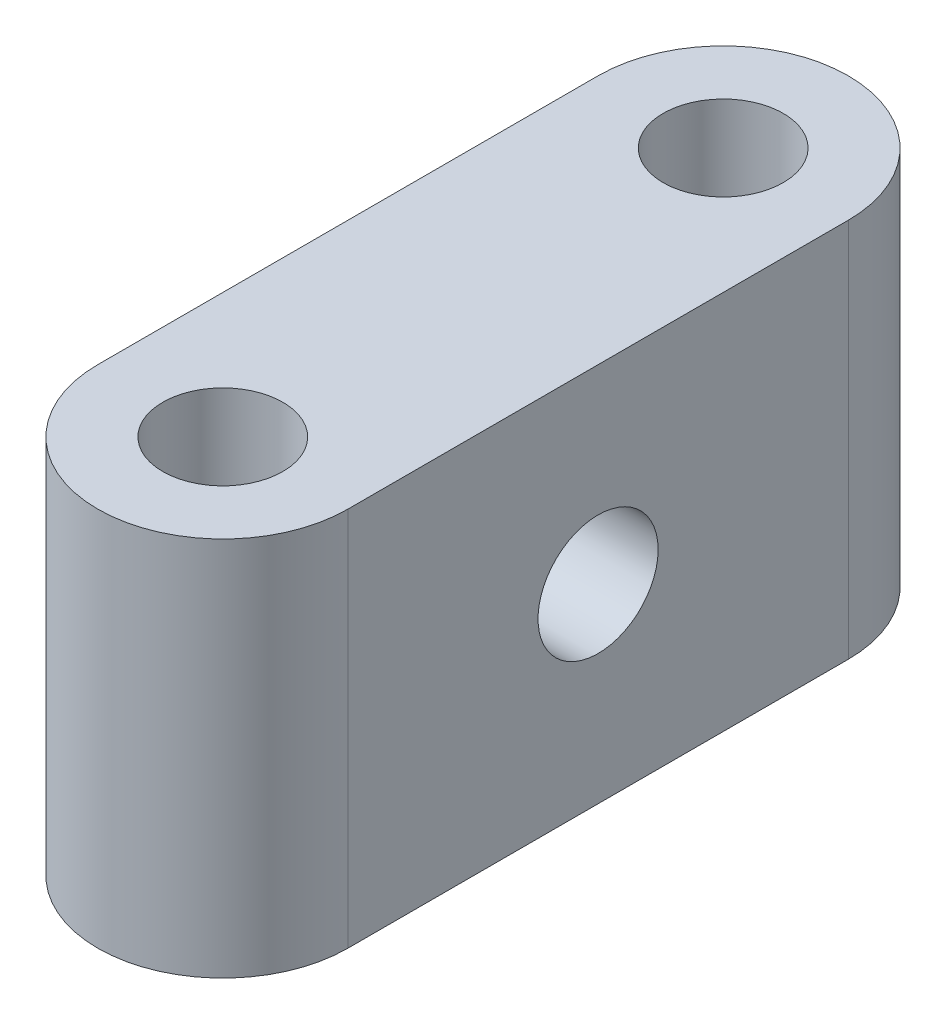
ISO-10303-21;
HEADER;
FILE_DESCRIPTION(('STEP AP214'),'2;1');
FILE_NAME('part.step','',(''),(''),'','','');
FILE_SCHEMA(('AUTOMOTIVE_DESIGN { 1 0 10303 214 1 1 1 1 }'));
ENDSEC;
DATA;
#1=APPLICATION_CONTEXT('core data for automotive mechanical design processes');
#2=APPLICATION_PROTOCOL_DEFINITION('international standard','automotive_design',2000,#1);
#3=PRODUCT_CONTEXT('',#1,'mechanical');
#4=PRODUCT('Part','Part','',(#3));
#5=PRODUCT_RELATED_PRODUCT_CATEGORY('part','',(#4));
#6=PRODUCT_DEFINITION_FORMATION('','',#4);
#7=PRODUCT_DEFINITION_CONTEXT('part definition',#1,'design');
#8=PRODUCT_DEFINITION('design','',#6,#7);
#9=PRODUCT_DEFINITION_SHAPE('','',#8);
#10=(LENGTH_UNIT() NAMED_UNIT(*) SI_UNIT(.MILLI.,.METRE.));
#11=(NAMED_UNIT(*) PLANE_ANGLE_UNIT() SI_UNIT($,.RADIAN.));
#12=(NAMED_UNIT(*) SI_UNIT($,.STERADIAN.) SOLID_ANGLE_UNIT());
#13=UNCERTAINTY_MEASURE_WITH_UNIT(LENGTH_MEASURE(1.E-05),#10,'distance_accuracy_value','');
#14=(GEOMETRIC_REPRESENTATION_CONTEXT(3) GLOBAL_UNCERTAINTY_ASSIGNED_CONTEXT((#13)) GLOBAL_UNIT_ASSIGNED_CONTEXT((#10,
#11,#12)) REPRESENTATION_CONTEXT('',''));
#15=CARTESIAN_POINT('',(0.,0.,0.));
#16=DIRECTION('',(0.,0.,1.));
#17=DIRECTION('',(1.,0.,0.));
#18=AXIS2_PLACEMENT_3D('',#15,#16,#17);
#19=CARTESIAN_POINT('',(0.,19.,0.));
#20=DIRECTION('',(0.,1.,0.));
#21=DIRECTION('',(0.,0.,1.));
#22=AXIS2_PLACEMENT_3D('',#19,#20,#21);
#23=PLANE('',#22);
#24=CARTESIAN_POINT('',(0.,19.,-50.));
#25=DIRECTION('',(0.,1.,0.));
#26=DIRECTION('',(0.,0.,1.));
#27=AXIS2_PLACEMENT_3D('',#24,#25,#26);
#28=CIRCLE('',#27,6.);
#29=CARTESIAN_POINT('',(0.,19.,-44.));
#30=VERTEX_POINT('',#29);
#31=EDGE_CURVE('E106',#30,#30,#28,.T.);
#32=ORIENTED_EDGE('',*,*,#31,.F.);
#33=EDGE_LOOP('',(#32));
#34=FACE_BOUND('',#33,.T.);
#35=CARTESIAN_POINT('',(0.,19.,0.));
#36=DIRECTION('',(0.,1.,0.));
#37=DIRECTION('',(0.,0.,1.));
#38=AXIS2_PLACEMENT_3D('',#35,#36,#37);
#39=CIRCLE('',#38,12.5);
#40=CARTESIAN_POINT('',(-12.5,19.,0.));
#41=VERTEX_POINT('',#40);
#42=CARTESIAN_POINT('',(12.5,19.,0.));
#43=VERTEX_POINT('',#42);
#44=EDGE_CURVE('E93',#41,#43,#39,.T.);
#45=ORIENTED_EDGE('',*,*,#44,.T.);
#46=DIRECTION('',(0.,0.,-1.));
#47=VECTOR('',#46,1.);
#48=CARTESIAN_POINT('',(12.5,19.,0.));
#49=LINE('',#48,#47);
#50=CARTESIAN_POINT('',(12.5,19.,-50.));
#51=VERTEX_POINT('',#50);
#52=EDGE_CURVE('E88',#43,#51,#49,.T.);
#53=ORIENTED_EDGE('',*,*,#52,.T.);
#54=CARTESIAN_POINT('',(0.,19.,-50.));
#55=DIRECTION('',(0.,1.,0.));
#56=DIRECTION('',(0.,0.,1.));
#57=AXIS2_PLACEMENT_3D('',#54,#55,#56);
#58=CIRCLE('',#57,12.5);
#59=CARTESIAN_POINT('',(-12.5,19.,-50.));
#60=VERTEX_POINT('',#59);
#61=EDGE_CURVE('E90',#51,#60,#58,.T.);
#62=ORIENTED_EDGE('',*,*,#61,.T.);
#63=DIRECTION('',(0.,0.,1.));
#64=VECTOR('',#63,1.);
#65=CARTESIAN_POINT('',(-12.5,19.,0.));
#66=LINE('',#65,#64);
#67=EDGE_CURVE('E57',#60,#41,#66,.T.);
#68=ORIENTED_EDGE('',*,*,#67,.T.);
#69=EDGE_LOOP('',(#45,#53,#62,#68));
#70=FACE_BOUND('',#69,.T.);
#71=CARTESIAN_POINT('',(0.,19.,0.));
#72=DIRECTION('',(0.,1.,0.));
#73=DIRECTION('',(0.,0.,1.));
#74=AXIS2_PLACEMENT_3D('',#71,#72,#73);
#75=CIRCLE('',#74,6.);
#76=CARTESIAN_POINT('',(0.,19.,6.));
#77=VERTEX_POINT('',#76);
#78=EDGE_CURVE('E122',#77,#77,#75,.T.);
#79=ORIENTED_EDGE('',*,*,#78,.F.);
#80=EDGE_LOOP('',(#79));
#81=FACE_BOUND('',#80,.T.);
#82=ADVANCED_FACE('F39',(#34,#70,#81),#23,.T.);
#83=CARTESIAN_POINT('',(0.,-19.,0.));
#84=DIRECTION('',(0.,1.,0.));
#85=DIRECTION('',(0.,0.,1.));
#86=AXIS2_PLACEMENT_3D('',#83,#84,#85);
#87=PLANE('',#86);
#88=CARTESIAN_POINT('',(0.,-19.,0.));
#89=DIRECTION('',(0.,1.,0.));
#90=DIRECTION('',(0.,0.,1.));
#91=AXIS2_PLACEMENT_3D('',#88,#89,#90);
#92=CIRCLE('',#91,12.5);
#93=CARTESIAN_POINT('',(-12.5,-19.,0.));
#94=VERTEX_POINT('',#93);
#95=CARTESIAN_POINT('',(12.5,-19.,0.));
#96=VERTEX_POINT('',#95);
#97=EDGE_CURVE('E103',#94,#96,#92,.T.);
#98=ORIENTED_EDGE('',*,*,#97,.F.);
#99=DIRECTION('',(0.,0.,1.));
#100=VECTOR('',#99,1.);
#101=CARTESIAN_POINT('',(-12.5,-19.,0.));
#102=LINE('',#101,#100);
#103=CARTESIAN_POINT('',(-12.5,-19.,-50.));
#104=VERTEX_POINT('',#103);
#105=EDGE_CURVE('E76',#104,#94,#102,.T.);
#106=ORIENTED_EDGE('',*,*,#105,.F.);
#107=CARTESIAN_POINT('',(0.,-19.,-50.));
#108=DIRECTION('',(0.,1.,0.));
#109=DIRECTION('',(0.,0.,1.));
#110=AXIS2_PLACEMENT_3D('',#107,#108,#109);
#111=CIRCLE('',#110,12.5);
#112=CARTESIAN_POINT('',(12.5,-19.,-50.));
#113=VERTEX_POINT('',#112);
#114=EDGE_CURVE('E71',#113,#104,#111,.T.);
#115=ORIENTED_EDGE('',*,*,#114,.F.);
#116=DIRECTION('',(0.,0.,-1.));
#117=VECTOR('',#116,1.);
#118=CARTESIAN_POINT('',(12.5,-19.,0.));
#119=LINE('',#118,#117);
#120=EDGE_CURVE('E92',#96,#113,#119,.T.);
#121=ORIENTED_EDGE('',*,*,#120,.F.);
#122=EDGE_LOOP('',(#98,#106,#115,#121));
#123=FACE_BOUND('',#122,.T.);
#124=CARTESIAN_POINT('',(0.,-19.,-50.));
#125=DIRECTION('',(0.,1.,0.));
#126=DIRECTION('',(0.,0.,1.));
#127=AXIS2_PLACEMENT_3D('',#124,#125,#126);
#128=CIRCLE('',#127,6.);
#129=CARTESIAN_POINT('',(0.,-19.,-44.));
#130=VERTEX_POINT('',#129);
#131=EDGE_CURVE('E119',#130,#130,#128,.T.);
#132=ORIENTED_EDGE('',*,*,#131,.T.);
#133=EDGE_LOOP('',(#132));
#134=FACE_BOUND('',#133,.T.);
#135=CARTESIAN_POINT('',(0.,-19.,0.));
#136=DIRECTION('',(0.,1.,0.));
#137=DIRECTION('',(0.,0.,1.));
#138=AXIS2_PLACEMENT_3D('',#135,#136,#137);
#139=CIRCLE('',#138,6.);
#140=CARTESIAN_POINT('',(0.,-19.,6.));
#141=VERTEX_POINT('',#140);
#142=EDGE_CURVE('E121',#141,#141,#139,.T.);
#143=ORIENTED_EDGE('',*,*,#142,.T.);
#144=EDGE_LOOP('',(#143));
#145=FACE_BOUND('',#144,.T.);
#146=ADVANCED_FACE('F111',(#123,#134,#145),#87,.F.);
#147=CARTESIAN_POINT('',(0.,19.,0.));
#148=DIRECTION('',(0.,-1.,0.));
#149=DIRECTION('',(0.,0.,-1.));
#150=AXIS2_PLACEMENT_3D('',#147,#148,#149);
#151=CYLINDRICAL_SURFACE('',#150,12.5);
#152=ORIENTED_EDGE('',*,*,#97,.T.);
#153=DIRECTION('',(0.,-1.,0.));
#154=VECTOR('',#153,1.);
#155=CARTESIAN_POINT('',(12.5,19.,0.));
#156=LINE('',#155,#154);
#157=EDGE_CURVE('E11',#43,#96,#156,.T.);
#158=ORIENTED_EDGE('',*,*,#157,.F.);
#159=ORIENTED_EDGE('',*,*,#44,.F.);
#160=DIRECTION('',(0.,-1.,0.));
#161=VECTOR('',#160,1.);
#162=CARTESIAN_POINT('',(-12.5,19.,0.));
#163=LINE('',#162,#161);
#164=EDGE_CURVE('E97',#41,#94,#163,.T.);
#165=ORIENTED_EDGE('',*,*,#164,.T.);
#166=EDGE_LOOP('',(#152,#158,#159,#165));
#167=FACE_BOUND('',#166,.T.);
#168=ADVANCED_FACE('F41',(#167),#151,.T.);
#169=CARTESIAN_POINT('',(12.5,19.,0.));
#170=DIRECTION('',(-1.,0.,0.));
#171=DIRECTION('',(0.,0.,1.));
#172=AXIS2_PLACEMENT_3D('',#169,#170,#171);
#173=PLANE('',#172);
#174=CARTESIAN_POINT('',(12.5,0.,-25.));
#175=DIRECTION('',(1.,0.,0.));
#176=DIRECTION('',(0.,0.,-1.));
#177=AXIS2_PLACEMENT_3D('',#174,#175,#176);
#178=CIRCLE('',#177,6.);
#179=CARTESIAN_POINT('',(12.5,0.,-31.));
#180=VERTEX_POINT('',#179);
#181=EDGE_CURVE('E128',#180,#180,#178,.T.);
#182=ORIENTED_EDGE('',*,*,#181,.F.);
#183=EDGE_LOOP('',(#182));
#184=FACE_BOUND('',#183,.T.);
#185=ORIENTED_EDGE('',*,*,#120,.T.);
#186=DIRECTION('',(0.,-1.,0.));
#187=VECTOR('',#186,1.);
#188=CARTESIAN_POINT('',(12.5,19.,-50.));
#189=LINE('',#188,#187);
#190=EDGE_CURVE('E48',#51,#113,#189,.T.);
#191=ORIENTED_EDGE('',*,*,#190,.F.);
#192=ORIENTED_EDGE('',*,*,#52,.F.);
#193=ORIENTED_EDGE('',*,*,#157,.T.);
#194=EDGE_LOOP('',(#185,#191,#192,#193));
#195=FACE_BOUND('',#194,.T.);
#196=ADVANCED_FACE('F94',(#184,#195),#173,.F.);
#197=CARTESIAN_POINT('',(0.,19.,-50.));
#198=DIRECTION('',(0.,-1.,0.));
#199=DIRECTION('',(0.,0.,-1.));
#200=AXIS2_PLACEMENT_3D('',#197,#198,#199);
#201=CYLINDRICAL_SURFACE('',#200,12.5);
#202=ORIENTED_EDGE('',*,*,#114,.T.);
#203=DIRECTION('',(0.,-1.,0.));
#204=VECTOR('',#203,1.);
#205=CARTESIAN_POINT('',(-12.5,19.,-50.));
#206=LINE('',#205,#204);
#207=EDGE_CURVE('E96',#60,#104,#206,.T.);
#208=ORIENTED_EDGE('',*,*,#207,.F.);
#209=ORIENTED_EDGE('',*,*,#61,.F.);
#210=ORIENTED_EDGE('',*,*,#190,.T.);
#211=EDGE_LOOP('',(#202,#208,#209,#210));
#212=FACE_BOUND('',#211,.T.);
#213=ADVANCED_FACE('F100',(#212),#201,.T.);
#214=CARTESIAN_POINT('',(-12.5,19.,0.));
#215=DIRECTION('',(1.,0.,0.));
#216=DIRECTION('',(0.,0.,-1.));
#217=AXIS2_PLACEMENT_3D('',#214,#215,#216);
#218=PLANE('',#217);
#219=ORIENTED_EDGE('',*,*,#105,.T.);
#220=ORIENTED_EDGE('',*,*,#164,.F.);
#221=ORIENTED_EDGE('',*,*,#67,.F.);
#222=ORIENTED_EDGE('',*,*,#207,.T.);
#223=EDGE_LOOP('',(#219,#220,#221,#222));
#224=FACE_BOUND('',#223,.T.);
#225=ADVANCED_FACE('F112',(#224),#218,.F.);
#226=CARTESIAN_POINT('',(0.,19.,-50.));
#227=DIRECTION('',(0.,-1.,0.));
#228=DIRECTION('',(0.,0.,-1.));
#229=AXIS2_PLACEMENT_3D('',#226,#227,#228);
#230=CYLINDRICAL_SURFACE('',#229,6.);
#231=ORIENTED_EDGE('',*,*,#31,.T.);
#232=EDGE_LOOP('',(#231));
#233=FACE_BOUND('',#232,.T.);
#234=ORIENTED_EDGE('',*,*,#131,.F.);
#235=EDGE_LOOP('',(#234));
#236=FACE_BOUND('',#235,.T.);
#237=ADVANCED_FACE('F161',(#233,#236),#230,.F.);
#238=CARTESIAN_POINT('',(0.,19.,0.));
#239=DIRECTION('',(0.,-1.,0.));
#240=DIRECTION('',(0.,0.,-1.));
#241=AXIS2_PLACEMENT_3D('',#238,#239,#240);
#242=CYLINDRICAL_SURFACE('',#241,6.);
#243=ORIENTED_EDGE('',*,*,#78,.T.);
#244=EDGE_LOOP('',(#243));
#245=FACE_BOUND('',#244,.T.);
#246=ORIENTED_EDGE('',*,*,#142,.F.);
#247=EDGE_LOOP('',(#246));
#248=FACE_BOUND('',#247,.T.);
#249=ADVANCED_FACE('F143',(#245,#248),#242,.F.);
#250=CARTESIAN_POINT('',(0.,0.,-25.));
#251=DIRECTION('',(1.,0.,0.));
#252=DIRECTION('',(0.,0.,-1.));
#253=AXIS2_PLACEMENT_3D('',#250,#251,#252);
#254=CYLINDRICAL_SURFACE('',#253,6.);
#255=CARTESIAN_POINT('',(0.,0.,-25.));
#256=DIRECTION('',(1.,0.,0.));
#257=DIRECTION('',(0.,0.,-1.));
#258=AXIS2_PLACEMENT_3D('',#255,#256,#257);
#259=CIRCLE('',#258,6.);
#260=CARTESIAN_POINT('',(0.,0.,-31.));
#261=VERTEX_POINT('',#260);
#262=EDGE_CURVE('E130',#261,#261,#259,.T.);
#263=ORIENTED_EDGE('',*,*,#262,.F.);
#264=EDGE_LOOP('',(#263));
#265=FACE_BOUND('',#264,.T.);
#266=ORIENTED_EDGE('',*,*,#181,.T.);
#267=EDGE_LOOP('',(#266));
#268=FACE_BOUND('',#267,.T.);
#269=ADVANCED_FACE('F139',(#265,#268),#254,.F.);
#270=CARTESIAN_POINT('',(0.,0.,-25.));
#271=DIRECTION('',(1.,0.,0.));
#272=DIRECTION('',(0.,0.,-1.));
#273=AXIS2_PLACEMENT_3D('',#270,#271,#272);
#274=PLANE('',#273);
#275=ORIENTED_EDGE('',*,*,#262,.T.);
#276=EDGE_LOOP('',(#275));
#277=FACE_BOUND('',#276,.T.);
#278=ADVANCED_FACE('F137',(#277),#274,.T.);
#279=CLOSED_SHELL('',(#82,#146,#168,#196,#213,#225,#237,#249,#269,#278));
#280=MANIFOLD_SOLID_BREP('B2',#279);
#281=ADVANCED_BREP_SHAPE_REPRESENTATION('',(#18,#280),#14);
#282=SHAPE_DEFINITION_REPRESENTATION(#9,#281);
ENDSEC;
END-ISO-10303-21;
